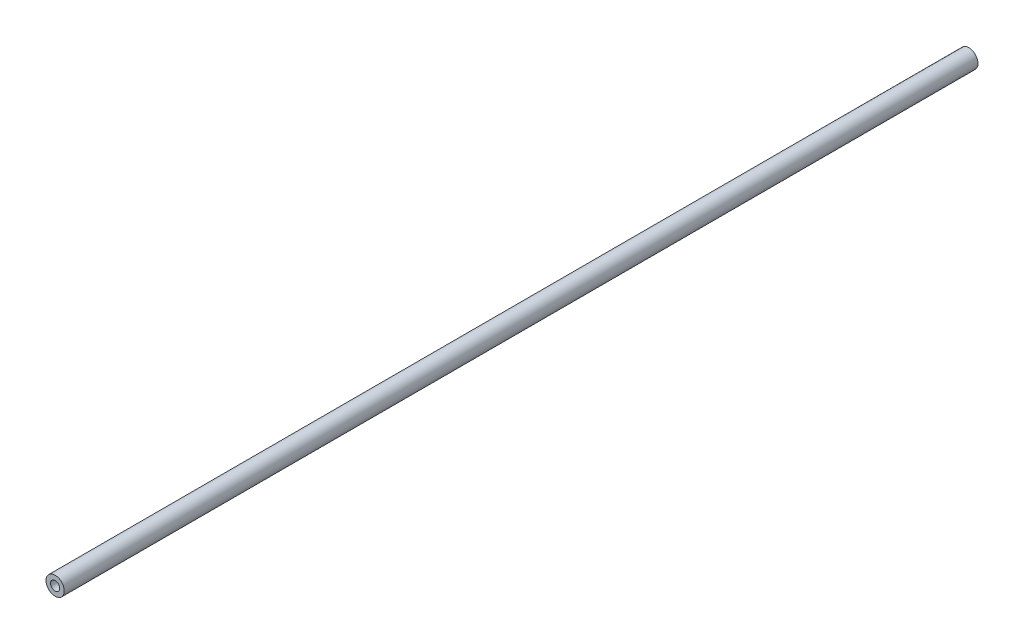
ISO-10303-21;
HEADER;
FILE_DESCRIPTION(('STEP AP214'),'2;1');
FILE_NAME('part.step','',(''),(''),'','','');
FILE_SCHEMA(('AUTOMOTIVE_DESIGN { 1 0 10303 214 1 1 1 1 }'));
ENDSEC;
DATA;
#1=APPLICATION_CONTEXT('core data for automotive mechanical design processes');
#2=APPLICATION_PROTOCOL_DEFINITION('international standard','automotive_design',2000,#1);
#3=PRODUCT_CONTEXT('',#1,'mechanical');
#4=PRODUCT('Part','Part','',(#3));
#5=PRODUCT_RELATED_PRODUCT_CATEGORY('part','',(#4));
#6=PRODUCT_DEFINITION_FORMATION('','',#4);
#7=PRODUCT_DEFINITION_CONTEXT('part definition',#1,'design');
#8=PRODUCT_DEFINITION('design','',#6,#7);
#9=PRODUCT_DEFINITION_SHAPE('','',#8);
#10=(LENGTH_UNIT() NAMED_UNIT(*) SI_UNIT(.MILLI.,.METRE.));
#11=(NAMED_UNIT(*) PLANE_ANGLE_UNIT() SI_UNIT($,.RADIAN.));
#12=(NAMED_UNIT(*) SI_UNIT($,.STERADIAN.) SOLID_ANGLE_UNIT());
#13=UNCERTAINTY_MEASURE_WITH_UNIT(LENGTH_MEASURE(1.E-05),#10,'distance_accuracy_value','');
#14=(GEOMETRIC_REPRESENTATION_CONTEXT(3) GLOBAL_UNCERTAINTY_ASSIGNED_CONTEXT((#13)) GLOBAL_UNIT_ASSIGNED_CONTEXT((#10,
#11,#12)) REPRESENTATION_CONTEXT('',''));
#15=CARTESIAN_POINT('',(0.,0.,0.));
#16=DIRECTION('',(0.,0.,1.));
#17=DIRECTION('',(1.,0.,0.));
#18=AXIS2_PLACEMENT_3D('',#15,#16,#17);
#19=CARTESIAN_POINT('',(0.,0.,200.));
#20=DIRECTION('',(0.,0.,1.));
#21=DIRECTION('',(1.,0.,0.));
#22=AXIS2_PLACEMENT_3D('',#19,#20,#21);
#23=PLANE('',#22);
#24=CARTESIAN_POINT('',(0.,0.,200.));
#25=DIRECTION('',(0.,0.,1.));
#26=DIRECTION('',(1.,0.,0.));
#27=AXIS2_PLACEMENT_3D('',#24,#25,#26);
#28=CIRCLE('',#27,2.);
#29=CARTESIAN_POINT('',(2.,0.,200.));
#30=VERTEX_POINT('',#29);
#31=EDGE_CURVE('E10',#30,#30,#28,.T.);
#32=ORIENTED_EDGE('',*,*,#31,.T.);
#33=EDGE_LOOP('',(#32));
#34=FACE_BOUND('',#33,.T.);
#35=CARTESIAN_POINT('',(0.,0.,200.));
#36=DIRECTION('',(0.,0.,1.));
#37=DIRECTION('',(1.,0.,0.));
#38=AXIS2_PLACEMENT_3D('',#35,#36,#37);
#39=CIRCLE('',#38,1.);
#40=CARTESIAN_POINT('',(1.,0.,200.));
#41=VERTEX_POINT('',#40);
#42=EDGE_CURVE('E42',#41,#41,#39,.T.);
#43=ORIENTED_EDGE('',*,*,#42,.F.);
#44=EDGE_LOOP('',(#43));
#45=FACE_BOUND('',#44,.T.);
#46=ADVANCED_FACE('F31',(#34,#45),#23,.T.);
#47=CARTESIAN_POINT('',(0.,0.,0.));
#48=DIRECTION('',(0.,0.,1.));
#49=DIRECTION('',(1.,0.,0.));
#50=AXIS2_PLACEMENT_3D('',#47,#48,#49);
#51=PLANE('',#50);
#52=CARTESIAN_POINT('',(0.,0.,0.));
#53=DIRECTION('',(0.,0.,1.));
#54=DIRECTION('',(1.,0.,0.));
#55=AXIS2_PLACEMENT_3D('',#52,#53,#54);
#56=CIRCLE('',#55,2.);
#57=CARTESIAN_POINT('',(2.,0.,0.));
#58=VERTEX_POINT('',#57);
#59=EDGE_CURVE('E35',#58,#58,#56,.T.);
#60=ORIENTED_EDGE('',*,*,#59,.F.);
#61=EDGE_LOOP('',(#60));
#62=FACE_BOUND('',#61,.T.);
#63=CARTESIAN_POINT('',(0.,0.,0.));
#64=DIRECTION('',(0.,0.,1.));
#65=DIRECTION('',(1.,0.,0.));
#66=AXIS2_PLACEMENT_3D('',#63,#64,#65);
#67=CIRCLE('',#66,1.);
#68=CARTESIAN_POINT('',(1.,0.,0.));
#69=VERTEX_POINT('',#68);
#70=EDGE_CURVE('E44',#69,#69,#67,.T.);
#71=ORIENTED_EDGE('',*,*,#70,.T.);
#72=EDGE_LOOP('',(#71));
#73=FACE_BOUND('',#72,.T.);
#74=ADVANCED_FACE('F54',(#62,#73),#51,.F.);
#75=CARTESIAN_POINT('',(0.,0.,200.));
#76=DIRECTION('',(0.,0.,-1.));
#77=DIRECTION('',(-1.,0.,0.));
#78=AXIS2_PLACEMENT_3D('',#75,#76,#77);
#79=CYLINDRICAL_SURFACE('',#78,2.);
#80=ORIENTED_EDGE('',*,*,#31,.F.);
#81=EDGE_LOOP('',(#80));
#82=FACE_BOUND('',#81,.T.);
#83=ORIENTED_EDGE('',*,*,#59,.T.);
#84=EDGE_LOOP('',(#83));
#85=FACE_BOUND('',#84,.T.);
#86=ADVANCED_FACE('F33',(#82,#85),#79,.T.);
#87=CARTESIAN_POINT('',(0.,0.,200.));
#88=DIRECTION('',(0.,0.,-1.));
#89=DIRECTION('',(-1.,0.,0.));
#90=AXIS2_PLACEMENT_3D('',#87,#88,#89);
#91=CYLINDRICAL_SURFACE('',#90,1.);
#92=ORIENTED_EDGE('',*,*,#42,.T.);
#93=EDGE_LOOP('',(#92));
#94=FACE_BOUND('',#93,.T.);
#95=ORIENTED_EDGE('',*,*,#70,.F.);
#96=EDGE_LOOP('',(#95));
#97=FACE_BOUND('',#96,.T.);
#98=ADVANCED_FACE('F50',(#94,#97),#91,.F.);
#99=CLOSED_SHELL('',(#46,#74,#86,#98));
#100=MANIFOLD_SOLID_BREP('B2',#99);
#101=ADVANCED_BREP_SHAPE_REPRESENTATION('',(#18,#100),#14);
#102=SHAPE_DEFINITION_REPRESENTATION(#9,#101);
ENDSEC;
END-ISO-10303-21;
